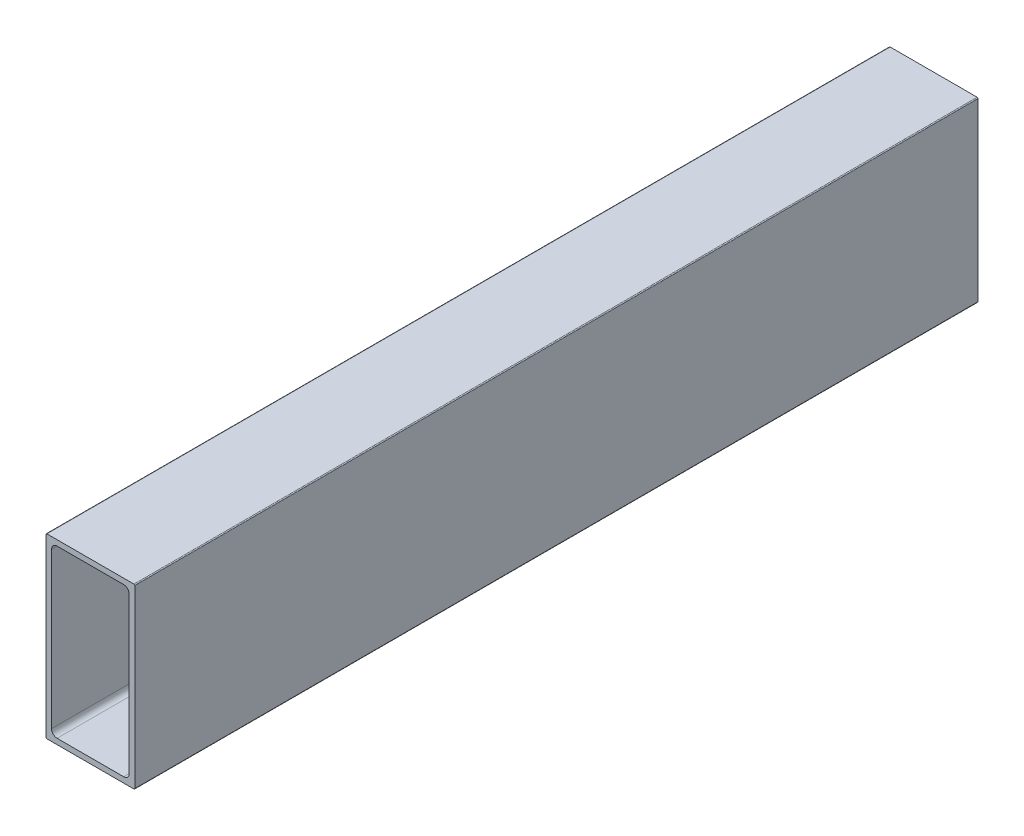
ISO-10303-21;
HEADER;
FILE_DESCRIPTION(('STEP AP214'),'2;1');
FILE_NAME('part.step','',(''),(''),'','','');
FILE_SCHEMA(('AUTOMOTIVE_DESIGN { 1 0 10303 214 1 1 1 1 }'));
ENDSEC;
DATA;
#1=APPLICATION_CONTEXT('core data for automotive mechanical design processes');
#2=APPLICATION_PROTOCOL_DEFINITION('international standard','automotive_design',2000,#1);
#3=PRODUCT_CONTEXT('',#1,'mechanical');
#4=PRODUCT('Part','Part','',(#3));
#5=PRODUCT_RELATED_PRODUCT_CATEGORY('part','',(#4));
#6=PRODUCT_DEFINITION_FORMATION('','',#4);
#7=PRODUCT_DEFINITION_CONTEXT('part definition',#1,'design');
#8=PRODUCT_DEFINITION('design','',#6,#7);
#9=PRODUCT_DEFINITION_SHAPE('','',#8);
#10=(LENGTH_UNIT() NAMED_UNIT(*) SI_UNIT(.MILLI.,.METRE.));
#11=(NAMED_UNIT(*) PLANE_ANGLE_UNIT() SI_UNIT($,.RADIAN.));
#12=(NAMED_UNIT(*) SI_UNIT($,.STERADIAN.) SOLID_ANGLE_UNIT());
#13=UNCERTAINTY_MEASURE_WITH_UNIT(LENGTH_MEASURE(1.E-05),#10,'distance_accuracy_value','');
#14=(GEOMETRIC_REPRESENTATION_CONTEXT(3) GLOBAL_UNCERTAINTY_ASSIGNED_CONTEXT((#13)) GLOBAL_UNIT_ASSIGNED_CONTEXT((#10,
#11,#12)) REPRESENTATION_CONTEXT('',''));
#15=CARTESIAN_POINT('',(0.,0.,0.));
#16=DIRECTION('',(0.,0.,1.));
#17=DIRECTION('',(1.,0.,0.));
#18=AXIS2_PLACEMENT_3D('',#15,#16,#17);
#19=CARTESIAN_POINT('',(-9.525,22.225,1828.8));
#20=DIRECTION('',(0.,0.,1.));
#21=DIRECTION('',(1.,0.,0.));
#22=AXIS2_PLACEMENT_3D('',#19,#20,#21);
#23=CYLINDRICAL_SURFACE('',#22,1.5875);
#24=CARTESIAN_POINT('',(-9.525,22.225,241.3));
#25=DIRECTION('',(0.,0.,1.));
#26=DIRECTION('',(1.,0.,0.));
#27=AXIS2_PLACEMENT_3D('',#24,#25,#26);
#28=CIRCLE('',#27,1.5875);
#29=CARTESIAN_POINT('',(-11.1125,22.225,241.3));
#30=VERTEX_POINT('',#29);
#31=CARTESIAN_POINT('',(-9.525,23.8125,241.3));
#32=VERTEX_POINT('',#31);
#33=EDGE_CURVE('E331',#30,#32,#28,.F.);
#34=ORIENTED_EDGE('',*,*,#33,.F.);
#35=DIRECTION('',(0.,0.,1.));
#36=VECTOR('',#35,1.);
#37=CARTESIAN_POINT('',(-11.1125,22.225,1828.8));
#38=LINE('',#37,#36);
#39=CARTESIAN_POINT('',(-11.1125,22.225,0.));
#40=VERTEX_POINT('',#39);
#41=EDGE_CURVE('E220',#40,#30,#38,.T.);
#42=ORIENTED_EDGE('',*,*,#41,.F.);
#43=CARTESIAN_POINT('',(-9.525,22.225,0.));
#44=DIRECTION('',(0.,0.,1.));
#45=DIRECTION('',(-1.,0.,0.));
#46=AXIS2_PLACEMENT_3D('',#43,#44,#45);
#47=CIRCLE('',#46,1.5875);
#48=CARTESIAN_POINT('',(-9.525,23.8125,0.));
#49=VERTEX_POINT('',#48);
#50=EDGE_CURVE('E203',#49,#40,#47,.T.);
#51=ORIENTED_EDGE('',*,*,#50,.F.);
#52=DIRECTION('',(0.,0.,-1.));
#53=VECTOR('',#52,1.);
#54=CARTESIAN_POINT('',(-9.525,23.8125,0.));
#55=LINE('',#54,#53);
#56=EDGE_CURVE('E48',#32,#49,#55,.T.);
#57=ORIENTED_EDGE('',*,*,#56,.F.);
#58=EDGE_LOOP('',(#34,#42,#51,#57));
#59=FACE_BOUND('',#58,.T.);
#60=ADVANCED_FACE('F41',(#59),#23,.F.);
#61=CARTESIAN_POINT('',(9.525,22.225,1828.8));
#62=DIRECTION('',(0.,0.,1.));
#63=DIRECTION('',(1.,0.,0.));
#64=AXIS2_PLACEMENT_3D('',#61,#62,#63);
#65=CYLINDRICAL_SURFACE('',#64,1.5875);
#66=CARTESIAN_POINT('',(9.525,22.225,241.3));
#67=DIRECTION('',(0.,0.,1.));
#68=DIRECTION('',(1.,0.,0.));
#69=AXIS2_PLACEMENT_3D('',#66,#67,#68);
#70=CIRCLE('',#69,1.5875);
#71=CARTESIAN_POINT('',(9.525,23.8125,241.3));
#72=VERTEX_POINT('',#71);
#73=CARTESIAN_POINT('',(11.1125,22.225,241.3));
#74=VERTEX_POINT('',#73);
#75=EDGE_CURVE('E320',#72,#74,#70,.F.);
#76=ORIENTED_EDGE('',*,*,#75,.F.);
#77=DIRECTION('',(0.,0.,1.));
#78=VECTOR('',#77,1.);
#79=CARTESIAN_POINT('',(9.525,23.8125,1828.8));
#80=LINE('',#79,#78);
#81=CARTESIAN_POINT('',(9.525,23.8125,0.));
#82=VERTEX_POINT('',#81);
#83=EDGE_CURVE('E239',#82,#72,#80,.T.);
#84=ORIENTED_EDGE('',*,*,#83,.F.);
#85=CARTESIAN_POINT('',(9.525,22.225,0.));
#86=DIRECTION('',(0.,0.,1.));
#87=DIRECTION('',(-1.,0.,0.));
#88=AXIS2_PLACEMENT_3D('',#85,#86,#87);
#89=CIRCLE('',#88,1.5875);
#90=CARTESIAN_POINT('',(11.1125,22.225,0.));
#91=VERTEX_POINT('',#90);
#92=EDGE_CURVE('E204',#91,#82,#89,.T.);
#93=ORIENTED_EDGE('',*,*,#92,.F.);
#94=DIRECTION('',(0.,0.,-1.));
#95=VECTOR('',#94,1.);
#96=CARTESIAN_POINT('',(11.1125,22.225,0.));
#97=LINE('',#96,#95);
#98=EDGE_CURVE('E237',#74,#91,#97,.T.);
#99=ORIENTED_EDGE('',*,*,#98,.F.);
#100=EDGE_LOOP('',(#76,#84,#93,#99));
#101=FACE_BOUND('',#100,.T.);
#102=ADVANCED_FACE('F375',(#101),#65,.F.);
#103=CARTESIAN_POINT('',(9.525,-22.225,1828.8));
#104=DIRECTION('',(0.,0.,1.));
#105=DIRECTION('',(1.,0.,0.));
#106=AXIS2_PLACEMENT_3D('',#103,#104,#105);
#107=CYLINDRICAL_SURFACE('',#106,1.5875);
#108=CARTESIAN_POINT('',(9.525,-22.225,241.3));
#109=DIRECTION('',(0.,0.,1.));
#110=DIRECTION('',(1.,0.,0.));
#111=AXIS2_PLACEMENT_3D('',#108,#109,#110);
#112=CIRCLE('',#111,1.5875);
#113=CARTESIAN_POINT('',(11.1125,-22.225,241.3));
#114=VERTEX_POINT('',#113);
#115=CARTESIAN_POINT('',(9.525,-23.8125,241.3));
#116=VERTEX_POINT('',#115);
#117=EDGE_CURVE('E323',#114,#116,#112,.F.);
#118=ORIENTED_EDGE('',*,*,#117,.F.);
#119=DIRECTION('',(0.,0.,1.));
#120=VECTOR('',#119,1.);
#121=CARTESIAN_POINT('',(11.1125,-22.225,1828.8));
#122=LINE('',#121,#120);
#123=CARTESIAN_POINT('',(11.1125,-22.225,0.));
#124=VERTEX_POINT('',#123);
#125=EDGE_CURVE('E240',#124,#114,#122,.T.);
#126=ORIENTED_EDGE('',*,*,#125,.F.);
#127=CARTESIAN_POINT('',(9.525,-22.225,0.));
#128=DIRECTION('',(0.,0.,1.));
#129=DIRECTION('',(-1.,0.,0.));
#130=AXIS2_PLACEMENT_3D('',#127,#128,#129);
#131=CIRCLE('',#130,1.5875);
#132=CARTESIAN_POINT('',(9.525,-23.8125,0.));
#133=VERTEX_POINT('',#132);
#134=EDGE_CURVE('E195',#133,#124,#131,.T.);
#135=ORIENTED_EDGE('',*,*,#134,.F.);
#136=DIRECTION('',(0.,0.,-1.));
#137=VECTOR('',#136,1.);
#138=CARTESIAN_POINT('',(9.525,-23.8125,0.));
#139=LINE('',#138,#137);
#140=EDGE_CURVE('E225',#116,#133,#139,.T.);
#141=ORIENTED_EDGE('',*,*,#140,.F.);
#142=EDGE_LOOP('',(#118,#126,#135,#141));
#143=FACE_BOUND('',#142,.T.);
#144=ADVANCED_FACE('F301',(#143),#107,.F.);
#145=CARTESIAN_POINT('',(-9.525,-22.225,1828.8));
#146=DIRECTION('',(0.,0.,1.));
#147=DIRECTION('',(1.,0.,0.));
#148=AXIS2_PLACEMENT_3D('',#145,#146,#147);
#149=CYLINDRICAL_SURFACE('',#148,1.5875);
#150=CARTESIAN_POINT('',(-9.525,-22.225,241.3));
#151=DIRECTION('',(0.,0.,1.));
#152=DIRECTION('',(1.,0.,0.));
#153=AXIS2_PLACEMENT_3D('',#150,#151,#152);
#154=CIRCLE('',#153,1.5875);
#155=CARTESIAN_POINT('',(-9.525,-23.8125,241.3));
#156=VERTEX_POINT('',#155);
#157=CARTESIAN_POINT('',(-11.1125,-22.225,241.3));
#158=VERTEX_POINT('',#157);
#159=EDGE_CURVE('E55',#156,#158,#154,.F.);
#160=ORIENTED_EDGE('',*,*,#159,.F.);
#161=DIRECTION('',(0.,0.,1.));
#162=VECTOR('',#161,1.);
#163=CARTESIAN_POINT('',(-9.525,-23.8125,1828.8));
#164=LINE('',#163,#162);
#165=CARTESIAN_POINT('',(-9.525,-23.8125,0.));
#166=VERTEX_POINT('',#165);
#167=EDGE_CURVE('E221',#166,#156,#164,.T.);
#168=ORIENTED_EDGE('',*,*,#167,.F.);
#169=CARTESIAN_POINT('',(-9.525,-22.225,0.));
#170=DIRECTION('',(0.,0.,1.));
#171=DIRECTION('',(-1.,0.,0.));
#172=AXIS2_PLACEMENT_3D('',#169,#170,#171);
#173=CIRCLE('',#172,1.5875);
#174=CARTESIAN_POINT('',(-11.1125,-22.225,0.));
#175=VERTEX_POINT('',#174);
#176=EDGE_CURVE('E272',#175,#166,#173,.T.);
#177=ORIENTED_EDGE('',*,*,#176,.F.);
#178=DIRECTION('',(0.,0.,-1.));
#179=VECTOR('',#178,1.);
#180=CARTESIAN_POINT('',(-11.1125,-22.225,0.));
#181=LINE('',#180,#179);
#182=EDGE_CURVE('E218',#158,#175,#181,.T.);
#183=ORIENTED_EDGE('',*,*,#182,.F.);
#184=EDGE_LOOP('',(#160,#168,#177,#183));
#185=FACE_BOUND('',#184,.T.);
#186=ADVANCED_FACE('F292',(#185),#149,.F.);
#187=CARTESIAN_POINT('',(12.446,25.146,1828.8));
#188=DIRECTION('',(0.,0.,-1.));
#189=DIRECTION('',(-1.,0.,0.));
#190=AXIS2_PLACEMENT_3D('',#187,#188,#189);
#191=CYLINDRICAL_SURFACE('',#190,0.254);
#192=DIRECTION('',(0.,0.,-1.));
#193=VECTOR('',#192,1.);
#194=CARTESIAN_POINT('',(12.446,25.4,1828.8));
#195=LINE('',#194,#193);
#196=CARTESIAN_POINT('',(12.446,25.4,241.3));
#197=VERTEX_POINT('',#196);
#198=CARTESIAN_POINT('',(12.446,25.4,0.));
#199=VERTEX_POINT('',#198);
#200=EDGE_CURVE('E178',#197,#199,#195,.T.);
#201=ORIENTED_EDGE('',*,*,#200,.F.);
#202=CARTESIAN_POINT('',(12.446,25.146,241.3));
#203=DIRECTION('',(0.,0.,1.));
#204=DIRECTION('',(1.,0.,0.));
#205=AXIS2_PLACEMENT_3D('',#202,#203,#204);
#206=CIRCLE('',#205,0.254);
#207=CARTESIAN_POINT('',(12.7,25.146,241.3));
#208=VERTEX_POINT('',#207);
#209=EDGE_CURVE('E167',#197,#208,#206,.F.);
#210=ORIENTED_EDGE('',*,*,#209,.T.);
#211=DIRECTION('',(0.,0.,1.));
#212=VECTOR('',#211,1.);
#213=CARTESIAN_POINT('',(12.7,25.146,1828.8));
#214=LINE('',#213,#212);
#215=CARTESIAN_POINT('',(12.7,25.146,0.));
#216=VERTEX_POINT('',#215);
#217=EDGE_CURVE('E176',#216,#208,#214,.T.);
#218=ORIENTED_EDGE('',*,*,#217,.F.);
#219=CARTESIAN_POINT('',(12.446,25.146,0.));
#220=DIRECTION('',(0.,0.,-1.));
#221=DIRECTION('',(-1.,0.,0.));
#222=AXIS2_PLACEMENT_3D('',#219,#220,#221);
#223=CIRCLE('',#222,0.254);
#224=EDGE_CURVE('E229',#199,#216,#223,.T.);
#225=ORIENTED_EDGE('',*,*,#224,.F.);
#226=EDGE_LOOP('',(#201,#210,#218,#225));
#227=FACE_BOUND('',#226,.T.);
#228=ADVANCED_FACE('F174',(#227),#191,.T.);
#229=CARTESIAN_POINT('',(-12.446,25.146,1828.8));
#230=DIRECTION('',(0.,0.,-1.));
#231=DIRECTION('',(-1.,0.,0.));
#232=AXIS2_PLACEMENT_3D('',#229,#230,#231);
#233=CYLINDRICAL_SURFACE('',#232,0.254);
#234=DIRECTION('',(0.,0.,-1.));
#235=VECTOR('',#234,1.);
#236=CARTESIAN_POINT('',(-12.7,25.146,1828.8));
#237=LINE('',#236,#235);
#238=CARTESIAN_POINT('',(-12.7,25.146,241.3));
#239=VERTEX_POINT('',#238);
#240=CARTESIAN_POINT('',(-12.7,25.146,0.));
#241=VERTEX_POINT('',#240);
#242=EDGE_CURVE('E206',#239,#241,#237,.T.);
#243=ORIENTED_EDGE('',*,*,#242,.F.);
#244=CARTESIAN_POINT('',(-12.446,25.146,241.3));
#245=DIRECTION('',(0.,0.,1.));
#246=DIRECTION('',(1.,0.,0.));
#247=AXIS2_PLACEMENT_3D('',#244,#245,#246);
#248=CIRCLE('',#247,0.254);
#249=CARTESIAN_POINT('',(-12.446,25.4,241.3));
#250=VERTEX_POINT('',#249);
#251=EDGE_CURVE('E338',#239,#250,#248,.F.);
#252=ORIENTED_EDGE('',*,*,#251,.T.);
#253=DIRECTION('',(0.,0.,1.));
#254=VECTOR('',#253,1.);
#255=CARTESIAN_POINT('',(-12.446,25.4,1828.8));
#256=LINE('',#255,#254);
#257=CARTESIAN_POINT('',(-12.446,25.4,0.));
#258=VERTEX_POINT('',#257);
#259=EDGE_CURVE('E186',#258,#250,#256,.T.);
#260=ORIENTED_EDGE('',*,*,#259,.F.);
#261=CARTESIAN_POINT('',(-12.446,25.146,0.));
#262=DIRECTION('',(0.,0.,-1.));
#263=DIRECTION('',(-1.,0.,0.));
#264=AXIS2_PLACEMENT_3D('',#261,#262,#263);
#265=CIRCLE('',#264,0.254);
#266=EDGE_CURVE('E199',#241,#258,#265,.T.);
#267=ORIENTED_EDGE('',*,*,#266,.F.);
#268=EDGE_LOOP('',(#243,#252,#260,#267));
#269=FACE_BOUND('',#268,.T.);
#270=ADVANCED_FACE('F365',(#269),#233,.T.);
#271=CARTESIAN_POINT('',(-12.446,-25.146,1828.8));
#272=DIRECTION('',(0.,0.,-1.));
#273=DIRECTION('',(-1.,0.,0.));
#274=AXIS2_PLACEMENT_3D('',#271,#272,#273);
#275=CYLINDRICAL_SURFACE('',#274,0.254);
#276=DIRECTION('',(0.,0.,-1.));
#277=VECTOR('',#276,1.);
#278=CARTESIAN_POINT('',(-12.446,-25.4,1828.8));
#279=LINE('',#278,#277);
#280=CARTESIAN_POINT('',(-12.446,-25.4,241.3));
#281=VERTEX_POINT('',#280);
#282=CARTESIAN_POINT('',(-12.446,-25.4,0.));
#283=VERTEX_POINT('',#282);
#284=EDGE_CURVE('E217',#281,#283,#279,.T.);
#285=ORIENTED_EDGE('',*,*,#284,.F.);
#286=CARTESIAN_POINT('',(-12.446,-25.146,241.3));
#287=DIRECTION('',(0.,0.,1.));
#288=DIRECTION('',(1.,0.,0.));
#289=AXIS2_PLACEMENT_3D('',#286,#287,#288);
#290=CIRCLE('',#289,0.254);
#291=CARTESIAN_POINT('',(-12.7,-25.146,241.3));
#292=VERTEX_POINT('',#291);
#293=EDGE_CURVE('E341',#281,#292,#290,.F.);
#294=ORIENTED_EDGE('',*,*,#293,.T.);
#295=DIRECTION('',(0.,0.,1.));
#296=VECTOR('',#295,1.);
#297=CARTESIAN_POINT('',(-12.7,-25.146,1828.8));
#298=LINE('',#297,#296);
#299=CARTESIAN_POINT('',(-12.7,-25.146,0.));
#300=VERTEX_POINT('',#299);
#301=EDGE_CURVE('E209',#300,#292,#298,.T.);
#302=ORIENTED_EDGE('',*,*,#301,.F.);
#303=CARTESIAN_POINT('',(-12.446,-25.146,0.));
#304=DIRECTION('',(0.,0.,-1.));
#305=DIRECTION('',(-1.,0.,0.));
#306=AXIS2_PLACEMENT_3D('',#303,#304,#305);
#307=CIRCLE('',#306,0.254);
#308=EDGE_CURVE('E267',#283,#300,#307,.T.);
#309=ORIENTED_EDGE('',*,*,#308,.F.);
#310=EDGE_LOOP('',(#285,#294,#302,#309));
#311=FACE_BOUND('',#310,.T.);
#312=ADVANCED_FACE('F359',(#311),#275,.T.);
#313=CARTESIAN_POINT('',(12.446,-25.146,1828.8));
#314=DIRECTION('',(0.,0.,-1.));
#315=DIRECTION('',(-1.,0.,0.));
#316=AXIS2_PLACEMENT_3D('',#313,#314,#315);
#317=CYLINDRICAL_SURFACE('',#316,0.254);
#318=DIRECTION('',(0.,0.,-1.));
#319=VECTOR('',#318,1.);
#320=CARTESIAN_POINT('',(12.7,-25.146,1828.8));
#321=LINE('',#320,#319);
#322=CARTESIAN_POINT('',(12.7,-25.146,241.3));
#323=VERTEX_POINT('',#322);
#324=CARTESIAN_POINT('',(12.7,-25.146,0.));
#325=VERTEX_POINT('',#324);
#326=EDGE_CURVE('E187',#323,#325,#321,.T.);
#327=ORIENTED_EDGE('',*,*,#326,.F.);
#328=CARTESIAN_POINT('',(12.446,-25.146,241.3));
#329=DIRECTION('',(0.,0.,1.));
#330=DIRECTION('',(1.,0.,0.));
#331=AXIS2_PLACEMENT_3D('',#328,#329,#330);
#332=CIRCLE('',#331,0.254);
#333=CARTESIAN_POINT('',(12.446,-25.4,241.3));
#334=VERTEX_POINT('',#333);
#335=EDGE_CURVE('E62',#323,#334,#332,.F.);
#336=ORIENTED_EDGE('',*,*,#335,.T.);
#337=DIRECTION('',(0.,0.,1.));
#338=VECTOR('',#337,1.);
#339=CARTESIAN_POINT('',(12.446,-25.4,1828.8));
#340=LINE('',#339,#338);
#341=CARTESIAN_POINT('',(12.446,-25.4,0.));
#342=VERTEX_POINT('',#341);
#343=EDGE_CURVE('E208',#342,#334,#340,.T.);
#344=ORIENTED_EDGE('',*,*,#343,.F.);
#345=CARTESIAN_POINT('',(12.446,-25.146,0.));
#346=DIRECTION('',(0.,0.,-1.));
#347=DIRECTION('',(-1.,0.,0.));
#348=AXIS2_PLACEMENT_3D('',#345,#346,#347);
#349=CIRCLE('',#348,0.254);
#350=EDGE_CURVE('E260',#325,#342,#349,.T.);
#351=ORIENTED_EDGE('',*,*,#350,.F.);
#352=EDGE_LOOP('',(#327,#336,#344,#351));
#353=FACE_BOUND('',#352,.T.);
#354=ADVANCED_FACE('F348',(#353),#317,.T.);
#355=CARTESIAN_POINT('',(-11.1125,23.8125,1828.8));
#356=DIRECTION('',(0.,-1.,0.));
#357=DIRECTION('',(0.,0.,-1.));
#358=AXIS2_PLACEMENT_3D('',#355,#356,#357);
#359=PLANE('',#358);
#360=ORIENTED_EDGE('',*,*,#83,.T.);
#361=DIRECTION('',(-1.,0.,0.));
#362=VECTOR('',#361,1.);
#363=CARTESIAN_POINT('',(-11.1125,23.8125,241.3));
#364=LINE('',#363,#362);
#365=EDGE_CURVE('E327',#72,#32,#364,.T.);
#366=ORIENTED_EDGE('',*,*,#365,.T.);
#367=ORIENTED_EDGE('',*,*,#56,.T.);
#368=DIRECTION('',(-1.,0.,0.));
#369=VECTOR('',#368,1.);
#370=CARTESIAN_POINT('',(-11.1125,23.8125,0.));
#371=LINE('',#370,#369);
#372=EDGE_CURVE('E201',#82,#49,#371,.T.);
#373=ORIENTED_EDGE('',*,*,#372,.F.);
#374=EDGE_LOOP('',(#360,#366,#367,#373));
#375=FACE_BOUND('',#374,.T.);
#376=ADVANCED_FACE('F390',(#375),#359,.T.);
#377=CARTESIAN_POINT('',(11.1125,-23.8125,1828.8));
#378=DIRECTION('',(-1.,0.,0.));
#379=DIRECTION('',(0.,0.,1.));
#380=AXIS2_PLACEMENT_3D('',#377,#378,#379);
#381=PLANE('',#380);
#382=ORIENTED_EDGE('',*,*,#125,.T.);
#383=DIRECTION('',(0.,1.,0.));
#384=VECTOR('',#383,1.);
#385=CARTESIAN_POINT('',(11.1125,-23.8125,241.3));
#386=LINE('',#385,#384);
#387=EDGE_CURVE('E316',#114,#74,#386,.T.);
#388=ORIENTED_EDGE('',*,*,#387,.T.);
#389=ORIENTED_EDGE('',*,*,#98,.T.);
#390=DIRECTION('',(0.,1.,0.));
#391=VECTOR('',#390,1.);
#392=CARTESIAN_POINT('',(11.1125,-23.8125,0.));
#393=LINE('',#392,#391);
#394=EDGE_CURVE('E213',#124,#91,#393,.T.);
#395=ORIENTED_EDGE('',*,*,#394,.F.);
#396=EDGE_LOOP('',(#382,#388,#389,#395));
#397=FACE_BOUND('',#396,.T.);
#398=ADVANCED_FACE('F392',(#397),#381,.T.);
#399=CARTESIAN_POINT('',(-11.1125,-23.8125,1828.8));
#400=DIRECTION('',(0.,1.,0.));
#401=DIRECTION('',(1.,0.,0.));
#402=AXIS2_PLACEMENT_3D('',#399,#400,#401);
#403=PLANE('',#402);
#404=ORIENTED_EDGE('',*,*,#167,.T.);
#405=DIRECTION('',(1.,0.,0.));
#406=VECTOR('',#405,1.);
#407=CARTESIAN_POINT('',(-11.1125,-23.8125,241.3));
#408=LINE('',#407,#406);
#409=EDGE_CURVE('E298',#156,#116,#408,.T.);
#410=ORIENTED_EDGE('',*,*,#409,.T.);
#411=ORIENTED_EDGE('',*,*,#140,.T.);
#412=DIRECTION('',(1.,0.,0.));
#413=VECTOR('',#412,1.);
#414=CARTESIAN_POINT('',(-11.1125,-23.8125,0.));
#415=LINE('',#414,#413);
#416=EDGE_CURVE('E268',#166,#133,#415,.T.);
#417=ORIENTED_EDGE('',*,*,#416,.F.);
#418=EDGE_LOOP('',(#404,#410,#411,#417));
#419=FACE_BOUND('',#418,.T.);
#420=ADVANCED_FACE('F295',(#419),#403,.T.);
#421=CARTESIAN_POINT('',(-11.1125,-23.8125,1828.8));
#422=DIRECTION('',(1.,0.,0.));
#423=DIRECTION('',(0.,1.,0.));
#424=AXIS2_PLACEMENT_3D('',#421,#422,#423);
#425=PLANE('',#424);
#426=ORIENTED_EDGE('',*,*,#41,.T.);
#427=DIRECTION('',(0.,-1.,0.));
#428=VECTOR('',#427,1.);
#429=CARTESIAN_POINT('',(-11.1125,-23.8125,241.3));
#430=LINE('',#429,#428);
#431=EDGE_CURVE('E334',#30,#158,#430,.T.);
#432=ORIENTED_EDGE('',*,*,#431,.T.);
#433=ORIENTED_EDGE('',*,*,#182,.T.);
#434=DIRECTION('',(0.,-1.,0.));
#435=VECTOR('',#434,1.);
#436=CARTESIAN_POINT('',(-11.1125,-23.8125,0.));
#437=LINE('',#436,#435);
#438=EDGE_CURVE('E236',#40,#175,#437,.T.);
#439=ORIENTED_EDGE('',*,*,#438,.F.);
#440=EDGE_LOOP('',(#426,#432,#433,#439));
#441=FACE_BOUND('',#440,.T.);
#442=ADVANCED_FACE('F386',(#441),#425,.T.);
#443=CARTESIAN_POINT('',(-12.7,-25.4,1828.8));
#444=DIRECTION('',(0.,1.,0.));
#445=DIRECTION('',(1.,0.,0.));
#446=AXIS2_PLACEMENT_3D('',#443,#444,#445);
#447=PLANE('',#446);
#448=DIRECTION('',(1.,0.,0.));
#449=VECTOR('',#448,1.);
#450=CARTESIAN_POINT('',(-12.7,-25.4,241.3));
#451=LINE('',#450,#449);
#452=EDGE_CURVE('E344',#281,#334,#451,.T.);
#453=ORIENTED_EDGE('',*,*,#452,.F.);
#454=ORIENTED_EDGE('',*,*,#284,.T.);
#455=DIRECTION('',(1.,0.,0.));
#456=VECTOR('',#455,1.);
#457=CARTESIAN_POINT('',(-12.7,-25.4,0.));
#458=LINE('',#457,#456);
#459=EDGE_CURVE('E310',#283,#342,#458,.T.);
#460=ORIENTED_EDGE('',*,*,#459,.T.);
#461=ORIENTED_EDGE('',*,*,#343,.T.);
#462=EDGE_LOOP('',(#453,#454,#460,#461));
#463=FACE_BOUND('',#462,.T.);
#464=ADVANCED_FACE('F353',(#463),#447,.F.);
#465=CARTESIAN_POINT('',(-12.7,-25.4,1828.8));
#466=DIRECTION('',(1.,0.,0.));
#467=DIRECTION('',(0.,1.,0.));
#468=AXIS2_PLACEMENT_3D('',#465,#466,#467);
#469=PLANE('',#468);
#470=DIRECTION('',(0.,-1.,0.));
#471=VECTOR('',#470,1.);
#472=CARTESIAN_POINT('',(-12.7,-25.4,241.3));
#473=LINE('',#472,#471);
#474=EDGE_CURVE('E336',#239,#292,#473,.T.);
#475=ORIENTED_EDGE('',*,*,#474,.F.);
#476=ORIENTED_EDGE('',*,*,#242,.T.);
#477=DIRECTION('',(0.,-1.,0.));
#478=VECTOR('',#477,1.);
#479=CARTESIAN_POINT('',(-12.7,-25.4,0.));
#480=LINE('',#479,#478);
#481=EDGE_CURVE('E257',#241,#300,#480,.T.);
#482=ORIENTED_EDGE('',*,*,#481,.T.);
#483=ORIENTED_EDGE('',*,*,#301,.T.);
#484=EDGE_LOOP('',(#475,#476,#482,#483));
#485=FACE_BOUND('',#484,.T.);
#486=ADVANCED_FACE('F362',(#485),#469,.F.);
#487=CARTESIAN_POINT('',(-12.7,25.4,1828.8));
#488=DIRECTION('',(0.,-1.,0.));
#489=DIRECTION('',(0.,0.,-1.));
#490=AXIS2_PLACEMENT_3D('',#487,#488,#489);
#491=PLANE('',#490);
#492=DIRECTION('',(-1.,0.,0.));
#493=VECTOR('',#492,1.);
#494=CARTESIAN_POINT('',(-12.7,25.4,241.3));
#495=LINE('',#494,#493);
#496=EDGE_CURVE('E179',#197,#250,#495,.T.);
#497=ORIENTED_EDGE('',*,*,#496,.F.);
#498=ORIENTED_EDGE('',*,*,#200,.T.);
#499=DIRECTION('',(-1.,0.,0.));
#500=VECTOR('',#499,1.);
#501=CARTESIAN_POINT('',(-12.7,25.4,0.));
#502=LINE('',#501,#500);
#503=EDGE_CURVE('E232',#199,#258,#502,.T.);
#504=ORIENTED_EDGE('',*,*,#503,.T.);
#505=ORIENTED_EDGE('',*,*,#259,.T.);
#506=EDGE_LOOP('',(#497,#498,#504,#505));
#507=FACE_BOUND('',#506,.T.);
#508=ADVANCED_FACE('F245',(#507),#491,.F.);
#509=CARTESIAN_POINT('',(12.7,-25.4,1828.8));
#510=DIRECTION('',(-1.,0.,0.));
#511=DIRECTION('',(0.,0.,1.));
#512=AXIS2_PLACEMENT_3D('',#509,#510,#511);
#513=PLANE('',#512);
#514=DIRECTION('',(0.,1.,0.));
#515=VECTOR('',#514,1.);
#516=CARTESIAN_POINT('',(12.7,-25.4,241.3));
#517=LINE('',#516,#515);
#518=EDGE_CURVE('E11',#323,#208,#517,.T.);
#519=ORIENTED_EDGE('',*,*,#518,.F.);
#520=ORIENTED_EDGE('',*,*,#326,.T.);
#521=DIRECTION('',(0.,1.,0.));
#522=VECTOR('',#521,1.);
#523=CARTESIAN_POINT('',(12.7,-25.4,0.));
#524=LINE('',#523,#522);
#525=EDGE_CURVE('E184',#325,#216,#524,.T.);
#526=ORIENTED_EDGE('',*,*,#525,.T.);
#527=ORIENTED_EDGE('',*,*,#217,.T.);
#528=EDGE_LOOP('',(#519,#520,#526,#527));
#529=FACE_BOUND('',#528,.T.);
#530=ADVANCED_FACE('F182',(#529),#513,.F.);
#531=CARTESIAN_POINT('',(0.,0.,0.));
#532=DIRECTION('',(0.,0.,-1.));
#533=DIRECTION('',(0.,-1.,0.));
#534=AXIS2_PLACEMENT_3D('',#531,#532,#533);
#535=PLANE('',#534);
#536=ORIENTED_EDGE('',*,*,#394,.T.);
#537=ORIENTED_EDGE('',*,*,#92,.T.);
#538=ORIENTED_EDGE('',*,*,#372,.T.);
#539=ORIENTED_EDGE('',*,*,#50,.T.);
#540=ORIENTED_EDGE('',*,*,#438,.T.);
#541=ORIENTED_EDGE('',*,*,#176,.T.);
#542=ORIENTED_EDGE('',*,*,#416,.T.);
#543=ORIENTED_EDGE('',*,*,#134,.T.);
#544=EDGE_LOOP('',(#536,#537,#538,#539,#540,#541,#542,#543));
#545=FACE_BOUND('',#544,.T.);
#546=ORIENTED_EDGE('',*,*,#525,.F.);
#547=ORIENTED_EDGE('',*,*,#350,.T.);
#548=ORIENTED_EDGE('',*,*,#459,.F.);
#549=ORIENTED_EDGE('',*,*,#308,.T.);
#550=ORIENTED_EDGE('',*,*,#481,.F.);
#551=ORIENTED_EDGE('',*,*,#266,.T.);
#552=ORIENTED_EDGE('',*,*,#503,.F.);
#553=ORIENTED_EDGE('',*,*,#224,.T.);
#554=EDGE_LOOP('',(#546,#547,#548,#549,#550,#551,#552,#553));
#555=FACE_BOUND('',#554,.T.);
#556=ADVANCED_FACE('F249',(#545,#555),#535,.T.);
#557=CARTESIAN_POINT('',(0.,0.,241.3));
#558=DIRECTION('',(0.,0.,1.));
#559=DIRECTION('',(1.,0.,0.));
#560=AXIS2_PLACEMENT_3D('',#557,#558,#559);
#561=PLANE('',#560);
#562=ORIENTED_EDGE('',*,*,#117,.T.);
#563=ORIENTED_EDGE('',*,*,#409,.F.);
#564=ORIENTED_EDGE('',*,*,#159,.T.);
#565=ORIENTED_EDGE('',*,*,#431,.F.);
#566=ORIENTED_EDGE('',*,*,#33,.T.);
#567=ORIENTED_EDGE('',*,*,#365,.F.);
#568=ORIENTED_EDGE('',*,*,#75,.T.);
#569=ORIENTED_EDGE('',*,*,#387,.F.);
#570=EDGE_LOOP('',(#562,#563,#564,#565,#566,#567,#568,#569));
#571=FACE_BOUND('',#570,.T.);
#572=ORIENTED_EDGE('',*,*,#474,.T.);
#573=ORIENTED_EDGE('',*,*,#293,.F.);
#574=ORIENTED_EDGE('',*,*,#452,.T.);
#575=ORIENTED_EDGE('',*,*,#335,.F.);
#576=ORIENTED_EDGE('',*,*,#518,.T.);
#577=ORIENTED_EDGE('',*,*,#209,.F.);
#578=ORIENTED_EDGE('',*,*,#496,.T.);
#579=ORIENTED_EDGE('',*,*,#251,.F.);
#580=EDGE_LOOP('',(#572,#573,#574,#575,#576,#577,#578,#579));
#581=FACE_BOUND('',#580,.T.);
#582=ADVANCED_FACE('F166',(#571,#581),#561,.T.);
#583=CLOSED_SHELL('',(#60,#102,#144,#186,#228,#270,#312,#354,#376,#398,#420,#442,#464,#486,#508,
#530,#556,#582));
#584=MANIFOLD_SOLID_BREP('B2',#583);
#585=ADVANCED_BREP_SHAPE_REPRESENTATION('',(#18,#584),#14);
#586=SHAPE_DEFINITION_REPRESENTATION(#9,#585);
ENDSEC;
END-ISO-10303-21;
